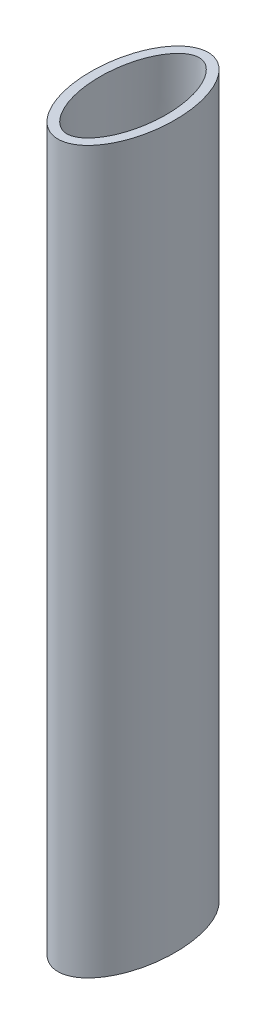
ISO-10303-21;
HEADER;
FILE_DESCRIPTION(('STEP AP214'),'2;1');
FILE_NAME('part.step','',(''),(''),'','','');
FILE_SCHEMA(('AUTOMOTIVE_DESIGN { 1 0 10303 214 1 1 1 1 }'));
ENDSEC;
DATA;
#1=APPLICATION_CONTEXT('core data for automotive mechanical design processes');
#2=APPLICATION_PROTOCOL_DEFINITION('international standard','automotive_design',2000,#1);
#3=PRODUCT_CONTEXT('',#1,'mechanical');
#4=PRODUCT('Part','Part','',(#3));
#5=PRODUCT_RELATED_PRODUCT_CATEGORY('part','',(#4));
#6=PRODUCT_DEFINITION_FORMATION('','',#4);
#7=PRODUCT_DEFINITION_CONTEXT('part definition',#1,'design');
#8=PRODUCT_DEFINITION('design','',#6,#7);
#9=PRODUCT_DEFINITION_SHAPE('','',#8);
#10=(LENGTH_UNIT() NAMED_UNIT(*) SI_UNIT(.MILLI.,.METRE.));
#11=(NAMED_UNIT(*) PLANE_ANGLE_UNIT() SI_UNIT($,.RADIAN.));
#12=(NAMED_UNIT(*) SI_UNIT($,.STERADIAN.) SOLID_ANGLE_UNIT());
#13=UNCERTAINTY_MEASURE_WITH_UNIT(LENGTH_MEASURE(1.E-05),#10,'distance_accuracy_value','');
#14=(GEOMETRIC_REPRESENTATION_CONTEXT(3) GLOBAL_UNCERTAINTY_ASSIGNED_CONTEXT((#13)) GLOBAL_UNIT_ASSIGNED_CONTEXT((#10,
#11,#12)) REPRESENTATION_CONTEXT('',''));
#15=CARTESIAN_POINT('',(0.,0.,0.));
#16=DIRECTION('',(0.,0.,1.));
#17=DIRECTION('',(1.,0.,0.));
#18=AXIS2_PLACEMENT_3D('',#15,#16,#17);
#19=CARTESIAN_POINT('',(0.,120.,0.));
#20=DIRECTION('',(0.,1.,0.));
#21=DIRECTION('',(0.,0.,1.));
#22=AXIS2_PLACEMENT_3D('',#19,#20,#21);
#23=PLANE('',#22);
#24=CARTESIAN_POINT('',(0.,120.,0.));
#25=DIRECTION('',(0.,1.,0.));
#26=DIRECTION('',(0.,0.,-1.));
#27=AXIS2_PLACEMENT_3D('',#24,#25,#26);
#28=ELLIPSE('',#27,12.5,7.);
#29=CARTESIAN_POINT('',(0.,120.,-12.5));
#30=VERTEX_POINT('',#29);
#31=EDGE_CURVE('E10',#30,#30,#28,.T.);
#32=ORIENTED_EDGE('',*,*,#31,.T.);
#33=EDGE_LOOP('',(#32));
#34=FACE_BOUND('',#33,.T.);
#35=CARTESIAN_POINT('',(0.,120.,-11.));
#36=CARTESIAN_POINT('',(-0.283376448335068,120.,-11.));
#37=CARTESIAN_POINT('',(-0.850129345005203,120.,-10.9038752564122));
#38=CARTESIAN_POINT('',(-2.09110534528635,120.,-10.2513092819694));
#39=CARTESIAN_POINT('',(-3.73108968275357,120.,-8.35693055521172));
#40=CARTESIAN_POINT('',(-5.15846345748033,120.,-4.5776710204367));
#41=CARTESIAN_POINT('',(-5.67076827125983,120.,0.));
#42=CARTESIAN_POINT('',(-5.15846345748033,120.,4.5776710204367));
#43=CARTESIAN_POINT('',(-3.73108968275357,120.,8.35693055521172));
#44=CARTESIAN_POINT('',(-2.09110534528635,120.,10.2513092819694));
#45=CARTESIAN_POINT('',(-0.850129345005204,120.,10.9038752564122));
#46=CARTESIAN_POINT('',(0.,120.,11.0480623717939));
#47=CARTESIAN_POINT('',(0.850129345005203,120.,10.9038752564123));
#48=CARTESIAN_POINT('',(2.09110534528635,120.,10.2513092819694));
#49=CARTESIAN_POINT('',(3.73108968275357,120.,8.35693055521172));
#50=CARTESIAN_POINT('',(5.15846345748033,120.,4.5776710204367));
#51=CARTESIAN_POINT('',(5.67076827125983,120.,0.));
#52=CARTESIAN_POINT('',(5.15846345748033,120.,-4.5776710204367));
#53=CARTESIAN_POINT('',(3.73108968275357,120.,-8.35693055521171));
#54=CARTESIAN_POINT('',(2.09110534528635,120.,-10.2513092819694));
#55=CARTESIAN_POINT('',(0.850129345005205,120.,-10.9038752564122));
#56=CARTESIAN_POINT('',(0.283376448335069,120.,-11.));
#57=CARTESIAN_POINT('',(0.,120.,-11.));
#58=B_SPLINE_CURVE_WITH_KNOTS('',3,(#35,#36,#37,#38,#39,#40,#41,#42,#43,#44,#45,#46,#47,#48,#49,
#50,#51,#52,#53,#54,#55,#56,#57),.UNSPECIFIED.,.T.,.F.,(4,1,1,1,1,1,1,1,1,1,1,1,1,1,1,1,1,1,1,1,
4),(0.,0.196349540849362,0.392699081698724,0.785398163397448,1.17809724509617,1.5707963267949,
1.96349540849362,2.35619449019234,2.74889357189107,2.94524311274043,3.14159265358979,
3.33794219443916,3.53429173528852,3.92699081698724,4.31968989868597,4.71238898038469,
5.10508806208341,5.49778714378214,5.89048622548086,6.08683576633022,6.28318530717959),.UNSPECIFIED.);
#59=CARTESIAN_POINT('',(0.,120.,-11.));
#60=VERTEX_POINT('',#59);
#61=EDGE_CURVE('E48',#60,#60,#58,.T.);
#62=ORIENTED_EDGE('',*,*,#61,.F.);
#63=EDGE_LOOP('',(#62));
#64=FACE_BOUND('',#63,.T.);
#65=ADVANCED_FACE('F37',(#34,#64),#23,.T.);
#66=CARTESIAN_POINT('',(0.,0.,0.));
#67=DIRECTION('',(0.,1.,0.));
#68=DIRECTION('',(0.,0.,1.));
#69=AXIS2_PLACEMENT_3D('',#66,#67,#68);
#70=PLANE('',#69);
#71=CARTESIAN_POINT('',(0.,0.,0.));
#72=DIRECTION('',(0.,1.,0.));
#73=DIRECTION('',(0.,0.,-1.));
#74=AXIS2_PLACEMENT_3D('',#71,#72,#73);
#75=ELLIPSE('',#74,12.5,7.);
#76=CARTESIAN_POINT('',(0.,0.,-12.5));
#77=VERTEX_POINT('',#76);
#78=EDGE_CURVE('E42',#77,#77,#75,.T.);
#79=ORIENTED_EDGE('',*,*,#78,.F.);
#80=EDGE_LOOP('',(#79));
#81=FACE_BOUND('',#80,.T.);
#82=CARTESIAN_POINT('',(0.,0.,-11.));
#83=CARTESIAN_POINT('',(-0.283376448335068,0.,-11.));
#84=CARTESIAN_POINT('',(-0.850129345005203,0.,-10.9038752564122));
#85=CARTESIAN_POINT('',(-2.09110534528635,0.,-10.2513092819694));
#86=CARTESIAN_POINT('',(-3.73108968275357,0.,-8.35693055521172));
#87=CARTESIAN_POINT('',(-5.15846345748033,0.,-4.5776710204367));
#88=CARTESIAN_POINT('',(-5.67076827125983,0.,0.));
#89=CARTESIAN_POINT('',(-5.15846345748033,0.,4.5776710204367));
#90=CARTESIAN_POINT('',(-3.73108968275357,0.,8.35693055521172));
#91=CARTESIAN_POINT('',(-2.09110534528635,0.,10.2513092819694));
#92=CARTESIAN_POINT('',(-0.850129345005204,0.,10.9038752564122));
#93=CARTESIAN_POINT('',(0.,0.,11.0480623717939));
#94=CARTESIAN_POINT('',(0.850129345005203,0.,10.9038752564123));
#95=CARTESIAN_POINT('',(2.09110534528635,0.,10.2513092819694));
#96=CARTESIAN_POINT('',(3.73108968275357,0.,8.35693055521172));
#97=CARTESIAN_POINT('',(5.15846345748033,0.,4.5776710204367));
#98=CARTESIAN_POINT('',(5.67076827125983,0.,0.));
#99=CARTESIAN_POINT('',(5.15846345748033,0.,-4.5776710204367));
#100=CARTESIAN_POINT('',(3.73108968275357,0.,-8.35693055521171));
#101=CARTESIAN_POINT('',(2.09110534528635,0.,-10.2513092819694));
#102=CARTESIAN_POINT('',(0.850129345005205,0.,-10.9038752564122));
#103=CARTESIAN_POINT('',(0.283376448335069,0.,-11.));
#104=CARTESIAN_POINT('',(0.,0.,-11.));
#105=B_SPLINE_CURVE_WITH_KNOTS('',3,(#82,#83,#84,#85,#86,#87,#88,#89,#90,#91,#92,#93,#94,#95,
#96,#97,#98,#99,#100,#101,#102,#103,#104),.UNSPECIFIED.,.T.,.F.,(4,1,1,1,1,1,1,1,1,1,1,1,1,1,1,
1,1,1,1,1,4),(0.,0.196349540849362,0.392699081698724,0.785398163397448,1.17809724509617,
1.5707963267949,1.96349540849362,2.35619449019234,2.74889357189107,2.94524311274043,
3.14159265358979,3.33794219443916,3.53429173528852,3.92699081698724,4.31968989868597,
4.71238898038469,5.10508806208341,5.49778714378214,5.89048622548086,6.08683576633022,
6.28318530717959),.UNSPECIFIED.);
#106=CARTESIAN_POINT('',(0.,0.,-11.));
#107=VERTEX_POINT('',#106);
#108=EDGE_CURVE('E51',#107,#107,#105,.T.);
#109=ORIENTED_EDGE('',*,*,#108,.T.);
#110=EDGE_LOOP('',(#109));
#111=FACE_BOUND('',#110,.T.);
#112=ADVANCED_FACE('F72',(#81,#111),#70,.F.);
#113=DIRECTION('',(0.,-1.,0.));
#114=VECTOR('',#113,1.);
#115=SURFACE_OF_LINEAR_EXTRUSION('',#28,#114);
#116=ORIENTED_EDGE('',*,*,#31,.F.);
#117=EDGE_LOOP('',(#116));
#118=FACE_BOUND('',#117,.T.);
#119=ORIENTED_EDGE('',*,*,#78,.T.);
#120=EDGE_LOOP('',(#119));
#121=FACE_BOUND('',#120,.T.);
#122=ADVANCED_FACE('F39',(#118,#121),#115,.F.);
#123=DIRECTION('',(0.,-1.,0.));
#124=VECTOR('',#123,1.);
#125=SURFACE_OF_LINEAR_EXTRUSION('',#58,#124);
#126=ORIENTED_EDGE('',*,*,#61,.T.);
#127=EDGE_LOOP('',(#126));
#128=FACE_BOUND('',#127,.T.);
#129=ORIENTED_EDGE('',*,*,#108,.F.);
#130=EDGE_LOOP('',(#129));
#131=FACE_BOUND('',#130,.T.);
#132=ADVANCED_FACE('F67',(#128,#131),#125,.T.);
#133=CLOSED_SHELL('',(#65,#112,#122,#132));
#134=MANIFOLD_SOLID_BREP('B2',#133);
#135=ADVANCED_BREP_SHAPE_REPRESENTATION('',(#18,#134),#14);
#136=SHAPE_DEFINITION_REPRESENTATION(#9,#135);
ENDSEC;
END-ISO-10303-21;
